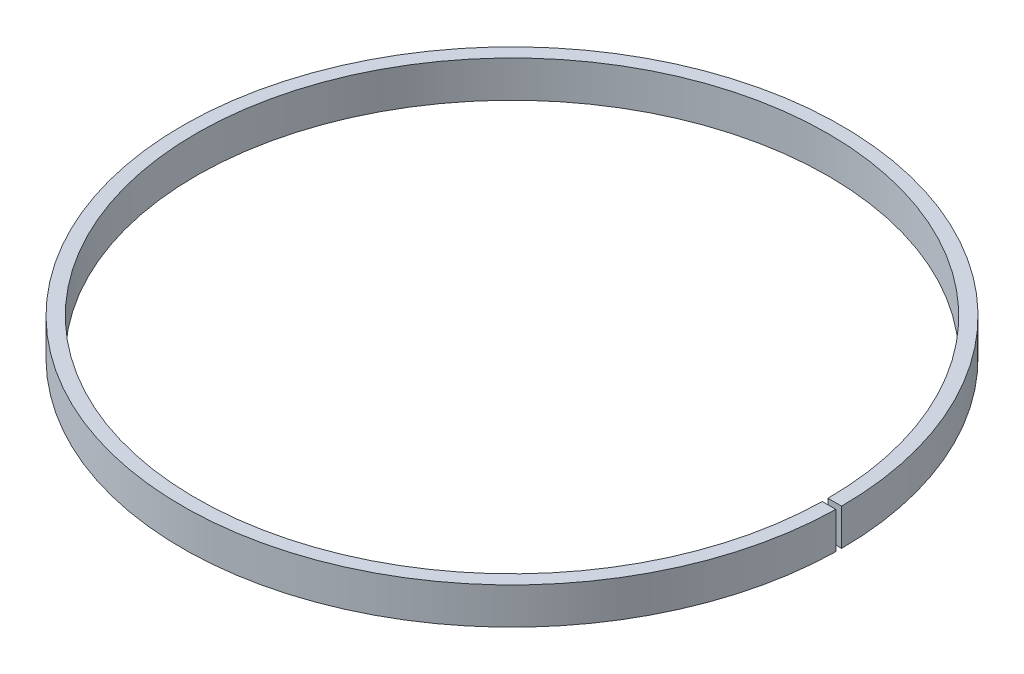
ISO-10303-21;
HEADER;
FILE_DESCRIPTION(('STEP AP214'),'2;1');
FILE_NAME('part.step','',(''),(''),'','','');
FILE_SCHEMA(('AUTOMOTIVE_DESIGN { 1 0 10303 214 1 1 1 1 }'));
ENDSEC;
DATA;
#1=APPLICATION_CONTEXT('core data for automotive mechanical design processes');
#2=APPLICATION_PROTOCOL_DEFINITION('international standard','automotive_design',2000,#1);
#3=PRODUCT_CONTEXT('',#1,'mechanical');
#4=PRODUCT('Part','Part','',(#3));
#5=PRODUCT_RELATED_PRODUCT_CATEGORY('part','',(#4));
#6=PRODUCT_DEFINITION_FORMATION('','',#4);
#7=PRODUCT_DEFINITION_CONTEXT('part definition',#1,'design');
#8=PRODUCT_DEFINITION('design','',#6,#7);
#9=PRODUCT_DEFINITION_SHAPE('','',#8);
#10=(LENGTH_UNIT() NAMED_UNIT(*) SI_UNIT(.MILLI.,.METRE.));
#11=(NAMED_UNIT(*) PLANE_ANGLE_UNIT() SI_UNIT($,.RADIAN.));
#12=(NAMED_UNIT(*) SI_UNIT($,.STERADIAN.) SOLID_ANGLE_UNIT());
#13=UNCERTAINTY_MEASURE_WITH_UNIT(LENGTH_MEASURE(1.E-05),#10,'distance_accuracy_value','');
#14=(GEOMETRIC_REPRESENTATION_CONTEXT(3) GLOBAL_UNCERTAINTY_ASSIGNED_CONTEXT((#13)) GLOBAL_UNIT_ASSIGNED_CONTEXT((#10,
#11,#12)) REPRESENTATION_CONTEXT('',''));
#15=CARTESIAN_POINT('',(0.,0.,0.));
#16=DIRECTION('',(0.,0.,1.));
#17=DIRECTION('',(1.,0.,0.));
#18=AXIS2_PLACEMENT_3D('',#15,#16,#17);
#19=CARTESIAN_POINT('',(54.7667574869609,0.,0.955957307842072));
#20=DIRECTION('',(0.,-1.,0.));
#21=DIRECTION('',(0.,0.,-1.));
#22=AXIS2_PLACEMENT_3D('',#19,#20,#21);
#23=PLANE('',#22);
#24=CARTESIAN_POINT('',(0.,0.,0.));
#25=DIRECTION('',(0.,-1.,0.));
#26=DIRECTION('',(0.,0.,-1.));
#27=AXIS2_PLACEMENT_3D('',#24,#25,#26);
#28=CIRCLE('',#27,57.1373);
#29=CARTESIAN_POINT('',(57.1285977124593,0.,0.99718338232819));
#30=VERTEX_POINT('',#29);
#31=CARTESIAN_POINT('',(57.1373,0.,0.));
#32=VERTEX_POINT('',#31);
#33=EDGE_CURVE('E13',#30,#32,#28,.T.);
#34=ORIENTED_EDGE('',*,*,#33,.T.);
#35=DIRECTION('',(1.,0.,0.));
#36=VECTOR('',#35,1.);
#37=CARTESIAN_POINT('',(54.7751,0.,0.));
#38=LINE('',#37,#36);
#39=CARTESIAN_POINT('',(54.7751,0.,0.));
#40=VERTEX_POINT('',#39);
#41=EDGE_CURVE('E86',#40,#32,#38,.T.);
#42=ORIENTED_EDGE('',*,*,#41,.F.);
#43=CARTESIAN_POINT('',(0.,0.,0.));
#44=DIRECTION('',(0.,-1.,0.));
#45=DIRECTION('',(0.,0.,-1.));
#46=AXIS2_PLACEMENT_3D('',#43,#44,#45);
#47=CIRCLE('',#46,54.7751);
#48=CARTESIAN_POINT('',(54.7667574869609,0.,0.955957307842072));
#49=VERTEX_POINT('',#48);
#50=EDGE_CURVE('E61',#49,#40,#47,.T.);
#51=ORIENTED_EDGE('',*,*,#50,.F.);
#52=DIRECTION('',(0.999847695156391,0.,0.0174524064372693));
#53=VECTOR('',#52,1.);
#54=CARTESIAN_POINT('',(54.7667574869609,0.,0.955957307842072));
#55=LINE('',#54,#53);
#56=EDGE_CURVE('E88',#49,#30,#55,.T.);
#57=ORIENTED_EDGE('',*,*,#56,.T.);
#58=EDGE_LOOP('',(#34,#42,#51,#57));
#59=FACE_BOUND('',#58,.T.);
#60=ADVANCED_FACE('F46',(#59),#23,.T.);
#61=CARTESIAN_POINT('',(0.,0.,0.));
#62=DIRECTION('',(0.,-1.,0.));
#63=DIRECTION('',(0.,0.,-1.));
#64=AXIS2_PLACEMENT_3D('',#61,#62,#63);
#65=CYLINDRICAL_SURFACE('',#64,57.1373);
#66=CARTESIAN_POINT('',(0.,6.35,0.));
#67=DIRECTION('',(0.,-1.,0.));
#68=DIRECTION('',(0.,0.,-1.));
#69=AXIS2_PLACEMENT_3D('',#66,#67,#68);
#70=CIRCLE('',#69,57.1373);
#71=CARTESIAN_POINT('',(57.1285977124593,6.35,0.99718338232819));
#72=VERTEX_POINT('',#71);
#73=CARTESIAN_POINT('',(57.1373,6.35,0.));
#74=VERTEX_POINT('',#73);
#75=EDGE_CURVE('E54',#72,#74,#70,.T.);
#76=ORIENTED_EDGE('',*,*,#75,.T.);
#77=DIRECTION('',(0.,1.,0.));
#78=VECTOR('',#77,1.);
#79=CARTESIAN_POINT('',(57.1373,0.,0.));
#80=LINE('',#79,#78);
#81=EDGE_CURVE('E97',#32,#74,#80,.T.);
#82=ORIENTED_EDGE('',*,*,#81,.F.);
#83=ORIENTED_EDGE('',*,*,#33,.F.);
#84=DIRECTION('',(0.,1.,0.));
#85=VECTOR('',#84,1.);
#86=CARTESIAN_POINT('',(57.1285977124593,0.,0.99718338232819));
#87=LINE('',#86,#85);
#88=EDGE_CURVE('E107',#30,#72,#87,.T.);
#89=ORIENTED_EDGE('',*,*,#88,.T.);
#90=EDGE_LOOP('',(#76,#82,#83,#89));
#91=FACE_BOUND('',#90,.T.);
#92=ADVANCED_FACE('F48',(#91),#65,.T.);
#93=CARTESIAN_POINT('',(54.7667574869609,6.35,0.955957307842072));
#94=DIRECTION('',(0.,1.,0.));
#95=DIRECTION('',(0.,0.,1.));
#96=AXIS2_PLACEMENT_3D('',#93,#94,#95);
#97=PLANE('',#96);
#98=CARTESIAN_POINT('',(0.,6.35,0.));
#99=DIRECTION('',(0.,-1.,0.));
#100=DIRECTION('',(0.,0.,-1.));
#101=AXIS2_PLACEMENT_3D('',#98,#99,#100);
#102=CIRCLE('',#101,54.7751);
#103=CARTESIAN_POINT('',(54.7667574869609,6.35,0.955957307842072));
#104=VERTEX_POINT('',#103);
#105=CARTESIAN_POINT('',(54.7751,6.35,0.));
#106=VERTEX_POINT('',#105);
#107=EDGE_CURVE('E69',#104,#106,#102,.T.);
#108=ORIENTED_EDGE('',*,*,#107,.T.);
#109=DIRECTION('',(-1.,0.,0.));
#110=VECTOR('',#109,1.);
#111=CARTESIAN_POINT('',(54.7751,6.35,0.));
#112=LINE('',#111,#110);
#113=EDGE_CURVE('E101',#74,#106,#112,.T.);
#114=ORIENTED_EDGE('',*,*,#113,.F.);
#115=ORIENTED_EDGE('',*,*,#75,.F.);
#116=DIRECTION('',(-0.999847695156391,0.,-0.0174524064372693));
#117=VECTOR('',#116,1.);
#118=CARTESIAN_POINT('',(54.7667574869609,6.35,0.955957307842072));
#119=LINE('',#118,#117);
#120=EDGE_CURVE('E109',#72,#104,#119,.T.);
#121=ORIENTED_EDGE('',*,*,#120,.T.);
#122=EDGE_LOOP('',(#108,#114,#115,#121));
#123=FACE_BOUND('',#122,.T.);
#124=ADVANCED_FACE('F115',(#123),#97,.T.);
#125=CARTESIAN_POINT('',(0.,0.,0.));
#126=DIRECTION('',(0.,-1.,0.));
#127=DIRECTION('',(0.,0.,-1.));
#128=AXIS2_PLACEMENT_3D('',#125,#126,#127);
#129=CYLINDRICAL_SURFACE('',#128,54.7751);
#130=DIRECTION('',(0.,-1.,0.));
#131=VECTOR('',#130,1.);
#132=CARTESIAN_POINT('',(54.7667574869609,0.,0.955957307842072));
#133=LINE('',#132,#131);
#134=EDGE_CURVE('E111',#104,#49,#133,.T.);
#135=ORIENTED_EDGE('',*,*,#134,.T.);
#136=ORIENTED_EDGE('',*,*,#50,.T.);
#137=DIRECTION('',(0.,-1.,0.));
#138=VECTOR('',#137,1.);
#139=CARTESIAN_POINT('',(54.7751,0.,0.));
#140=LINE('',#139,#138);
#141=EDGE_CURVE('E99',#106,#40,#140,.T.);
#142=ORIENTED_EDGE('',*,*,#141,.F.);
#143=ORIENTED_EDGE('',*,*,#107,.F.);
#144=EDGE_LOOP('',(#135,#136,#142,#143));
#145=FACE_BOUND('',#144,.T.);
#146=ADVANCED_FACE('F118',(#145),#129,.F.);
#147=CARTESIAN_POINT('',(0.,0.,0.));
#148=DIRECTION('',(-0.0174524064372693,0.,0.999847695156391));
#149=DIRECTION('',(0.999847695156391,0.,0.0174524064372693));
#150=AXIS2_PLACEMENT_3D('',#147,#148,#149);
#151=PLANE('',#150);
#152=ORIENTED_EDGE('',*,*,#56,.F.);
#153=ORIENTED_EDGE('',*,*,#134,.F.);
#154=ORIENTED_EDGE('',*,*,#120,.F.);
#155=ORIENTED_EDGE('',*,*,#88,.F.);
#156=EDGE_LOOP('',(#152,#153,#154,#155));
#157=FACE_BOUND('',#156,.T.);
#158=ADVANCED_FACE('F120',(#157),#151,.F.);
#159=CARTESIAN_POINT('',(0.,0.,0.));
#160=DIRECTION('',(0.,0.,1.));
#161=DIRECTION('',(1.,0.,0.));
#162=AXIS2_PLACEMENT_3D('',#159,#160,#161);
#163=PLANE('',#162);
#164=ORIENTED_EDGE('',*,*,#41,.T.);
#165=ORIENTED_EDGE('',*,*,#81,.T.);
#166=ORIENTED_EDGE('',*,*,#113,.T.);
#167=ORIENTED_EDGE('',*,*,#141,.T.);
#168=EDGE_LOOP('',(#164,#165,#166,#167));
#169=FACE_BOUND('',#168,.T.);
#170=ADVANCED_FACE('F95',(#169),#163,.T.);
#171=CLOSED_SHELL('',(#60,#92,#124,#146,#158,#170));
#172=MANIFOLD_SOLID_BREP('B2',#171);
#173=ADVANCED_BREP_SHAPE_REPRESENTATION('',(#18,#172),#14);
#174=SHAPE_DEFINITION_REPRESENTATION(#9,#173);
ENDSEC;
END-ISO-10303-21;
